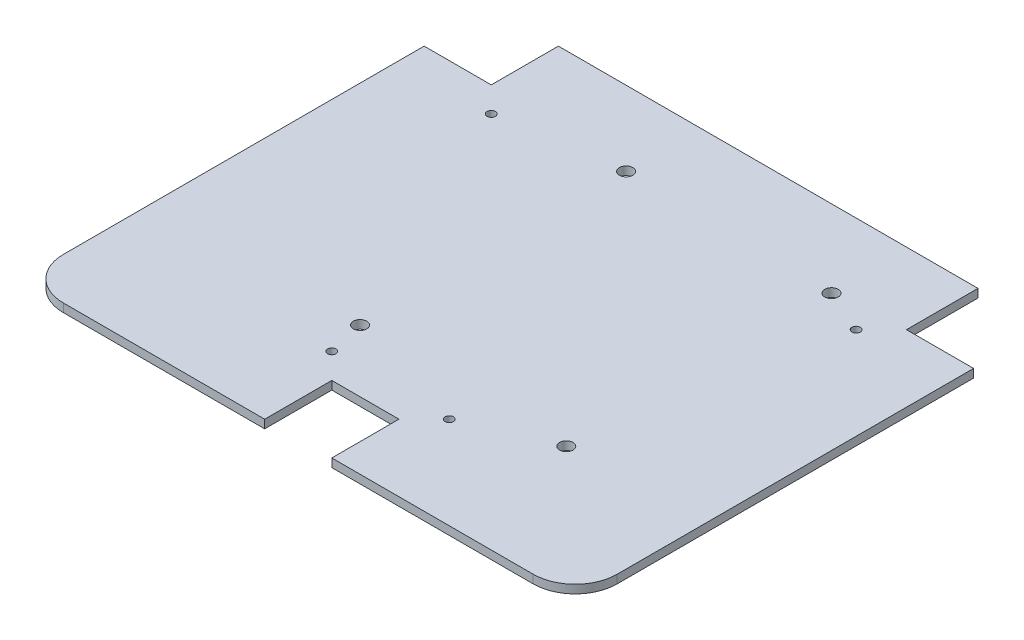
ISO-10303-21;
HEADER;
FILE_DESCRIPTION(('STEP AP214'),'2;1');
FILE_NAME('part.step','',(''),(''),'','','');
FILE_SCHEMA(('AUTOMOTIVE_DESIGN { 1 0 10303 214 1 1 1 1 }'));
ENDSEC;
DATA;
#1=APPLICATION_CONTEXT('core data for automotive mechanical design processes');
#2=APPLICATION_PROTOCOL_DEFINITION('international standard','automotive_design',2000,#1);
#3=PRODUCT_CONTEXT('',#1,'mechanical');
#4=PRODUCT('Part','Part','',(#3));
#5=PRODUCT_RELATED_PRODUCT_CATEGORY('part','',(#4));
#6=PRODUCT_DEFINITION_FORMATION('','',#4);
#7=PRODUCT_DEFINITION_CONTEXT('part definition',#1,'design');
#8=PRODUCT_DEFINITION('design','',#6,#7);
#9=PRODUCT_DEFINITION_SHAPE('','',#8);
#10=(LENGTH_UNIT() NAMED_UNIT(*) SI_UNIT(.MILLI.,.METRE.));
#11=(NAMED_UNIT(*) PLANE_ANGLE_UNIT() SI_UNIT($,.RADIAN.));
#12=(NAMED_UNIT(*) SI_UNIT($,.STERADIAN.) SOLID_ANGLE_UNIT());
#13=UNCERTAINTY_MEASURE_WITH_UNIT(LENGTH_MEASURE(1.E-05),#10,'distance_accuracy_value','');
#14=(GEOMETRIC_REPRESENTATION_CONTEXT(3) GLOBAL_UNCERTAINTY_ASSIGNED_CONTEXT((#13)) GLOBAL_UNIT_ASSIGNED_CONTEXT((#10,
#11,#12)) REPRESENTATION_CONTEXT('',''));
#15=CARTESIAN_POINT('',(0.,0.,0.));
#16=DIRECTION('',(0.,0.,1.));
#17=DIRECTION('',(1.,0.,0.));
#18=AXIS2_PLACEMENT_3D('',#15,#16,#17);
#19=CARTESIAN_POINT('',(0.,5.,155.796995794098));
#20=DIRECTION('',(0.,0.,1.));
#21=DIRECTION('',(1.,0.,0.));
#22=AXIS2_PLACEMENT_3D('',#19,#20,#21);
#23=PLANE('',#22);
#24=DIRECTION('',(-1.,0.,0.));
#25=VECTOR('',#24,1.);
#26=CARTESIAN_POINT('',(0.,0.,155.796995794098));
#27=LINE('',#26,#25);
#28=CARTESIAN_POINT('',(664.267355398383,0.,155.796995794098));
#29=VERTEX_POINT('',#28);
#30=CARTESIAN_POINT('',(544.267355398383,0.,155.796995794098));
#31=VERTEX_POINT('',#30);
#32=EDGE_CURVE('E164',#29,#31,#27,.T.);
#33=ORIENTED_EDGE('',*,*,#32,.F.);
#34=DIRECTION('',(0.,-1.,0.));
#35=VECTOR('',#34,1.);
#36=CARTESIAN_POINT('',(664.267355398383,5.,155.796995794098));
#37=LINE('',#36,#35);
#38=CARTESIAN_POINT('',(664.267355398383,5.,155.796995794098));
#39=VERTEX_POINT('',#38);
#40=EDGE_CURVE('E11',#39,#29,#37,.T.);
#41=ORIENTED_EDGE('',*,*,#40,.F.);
#42=DIRECTION('',(-1.,0.,0.));
#43=VECTOR('',#42,1.);
#44=CARTESIAN_POINT('',(0.,5.,155.796995794098));
#45=LINE('',#44,#43);
#46=CARTESIAN_POINT('',(544.267355398383,5.,155.796995794098));
#47=VERTEX_POINT('',#46);
#48=EDGE_CURVE('E202',#39,#47,#45,.T.);
#49=ORIENTED_EDGE('',*,*,#48,.T.);
#50=DIRECTION('',(0.,-1.,0.));
#51=VECTOR('',#50,1.);
#52=CARTESIAN_POINT('',(544.267355398383,5.,155.796995794098));
#53=LINE('',#52,#51);
#54=EDGE_CURVE('E51',#47,#31,#53,.T.);
#55=ORIENTED_EDGE('',*,*,#54,.T.);
#56=EDGE_LOOP('',(#33,#41,#49,#55));
#57=FACE_BOUND('',#56,.T.);
#58=ADVANCED_FACE('F35',(#57),#23,.T.);
#59=CARTESIAN_POINT('',(664.267355398383,5.,130.796995794098));
#60=DIRECTION('',(0.,-1.,0.));
#61=DIRECTION('',(0.,0.,-1.));
#62=AXIS2_PLACEMENT_3D('',#59,#60,#61);
#63=CYLINDRICAL_SURFACE('',#62,25.);
#64=CARTESIAN_POINT('',(664.267355398383,0.,130.796995794098));
#65=DIRECTION('',(0.,1.,0.));
#66=DIRECTION('',(0.,0.,1.));
#67=AXIS2_PLACEMENT_3D('',#64,#65,#66);
#68=CIRCLE('',#67,25.);
#69=CARTESIAN_POINT('',(689.267355398383,0.,130.796995794098));
#70=VERTEX_POINT('',#69);
#71=EDGE_CURVE('E166',#29,#70,#68,.T.);
#72=ORIENTED_EDGE('',*,*,#71,.T.);
#73=DIRECTION('',(0.,-1.,0.));
#74=VECTOR('',#73,1.);
#75=CARTESIAN_POINT('',(689.267355398383,5.,130.796995794098));
#76=LINE('',#75,#74);
#77=CARTESIAN_POINT('',(689.267355398383,5.,130.796995794098));
#78=VERTEX_POINT('',#77);
#79=EDGE_CURVE('E43',#78,#70,#76,.T.);
#80=ORIENTED_EDGE('',*,*,#79,.F.);
#81=CARTESIAN_POINT('',(664.267355398383,5.,130.796995794098));
#82=DIRECTION('',(0.,1.,0.));
#83=DIRECTION('',(0.,0.,1.));
#84=AXIS2_PLACEMENT_3D('',#81,#82,#83);
#85=CIRCLE('',#84,25.);
#86=EDGE_CURVE('E243',#39,#78,#85,.T.);
#87=ORIENTED_EDGE('',*,*,#86,.F.);
#88=ORIENTED_EDGE('',*,*,#40,.T.);
#89=EDGE_LOOP('',(#72,#80,#87,#88));
#90=FACE_BOUND('',#89,.T.);
#91=ADVANCED_FACE('F231',(#90),#63,.T.);
#92=CARTESIAN_POINT('',(689.267355398383,5.,3.60307849767731E-13));
#93=DIRECTION('',(1.,0.,0.));
#94=DIRECTION('',(0.,0.,-1.));
#95=AXIS2_PLACEMENT_3D('',#92,#93,#94);
#96=PLANE('',#95);
#97=DIRECTION('',(0.,0.,1.));
#98=VECTOR('',#97,1.);
#99=CARTESIAN_POINT('',(689.267355398383,0.,3.60307849767731E-13));
#100=LINE('',#99,#98);
#101=CARTESIAN_POINT('',(689.267355398383,0.,-81.5881877590993));
#102=VERTEX_POINT('',#101);
#103=EDGE_CURVE('E170',#102,#70,#100,.T.);
#104=ORIENTED_EDGE('',*,*,#103,.F.);
#105=DIRECTION('',(0.,-1.,0.));
#106=VECTOR('',#105,1.);
#107=CARTESIAN_POINT('',(689.267355398383,5.,-81.5881877590993));
#108=LINE('',#107,#106);
#109=CARTESIAN_POINT('',(689.267355398383,5.,-81.5881877590993));
#110=VERTEX_POINT('',#109);
#111=EDGE_CURVE('E221',#110,#102,#108,.T.);
#112=ORIENTED_EDGE('',*,*,#111,.F.);
#113=DIRECTION('',(0.,0.,1.));
#114=VECTOR('',#113,1.);
#115=CARTESIAN_POINT('',(689.267355398383,5.,3.60307849767731E-13));
#116=LINE('',#115,#114);
#117=EDGE_CURVE('E228',#110,#78,#116,.T.);
#118=ORIENTED_EDGE('',*,*,#117,.T.);
#119=ORIENTED_EDGE('',*,*,#79,.T.);
#120=EDGE_LOOP('',(#104,#112,#118,#119));
#121=FACE_BOUND('',#120,.T.);
#122=ADVANCED_FACE('F226',(#121),#96,.T.);
#123=CARTESIAN_POINT('',(0.,5.,-81.5881877590993));
#124=DIRECTION('',(0.,0.,-1.));
#125=DIRECTION('',(-1.,0.,0.));
#126=AXIS2_PLACEMENT_3D('',#123,#124,#125);
#127=PLANE('',#126);
#128=DIRECTION('',(1.,0.,0.));
#129=VECTOR('',#128,1.);
#130=CARTESIAN_POINT('',(0.,0.,-81.5881877590993));
#131=LINE('',#130,#129);
#132=CARTESIAN_POINT('',(649.267355398383,0.,-81.5881877590993));
#133=VERTEX_POINT('',#132);
#134=EDGE_CURVE('E173',#133,#102,#131,.T.);
#135=ORIENTED_EDGE('',*,*,#134,.F.);
#136=DIRECTION('',(0.,-1.,0.));
#137=VECTOR('',#136,1.);
#138=CARTESIAN_POINT('',(649.267355398383,5.,-81.5881877590993));
#139=LINE('',#138,#137);
#140=CARTESIAN_POINT('',(649.267355398383,5.,-81.5881877590993));
#141=VERTEX_POINT('',#140);
#142=EDGE_CURVE('E219',#141,#133,#139,.T.);
#143=ORIENTED_EDGE('',*,*,#142,.F.);
#144=DIRECTION('',(1.,0.,0.));
#145=VECTOR('',#144,1.);
#146=CARTESIAN_POINT('',(0.,5.,-81.5881877590993));
#147=LINE('',#146,#145);
#148=EDGE_CURVE('E240',#141,#110,#147,.T.);
#149=ORIENTED_EDGE('',*,*,#148,.T.);
#150=ORIENTED_EDGE('',*,*,#111,.T.);
#151=EDGE_LOOP('',(#135,#143,#149,#150));
#152=FACE_BOUND('',#151,.T.);
#153=ADVANCED_FACE('F237',(#152),#127,.T.);
#154=CARTESIAN_POINT('',(649.267355398383,5.,0.));
#155=DIRECTION('',(1.,0.,0.));
#156=DIRECTION('',(0.,0.,-1.));
#157=AXIS2_PLACEMENT_3D('',#154,#155,#156);
#158=PLANE('',#157);
#159=DIRECTION('',(0.,0.,1.));
#160=VECTOR('',#159,1.);
#161=CARTESIAN_POINT('',(649.267355398383,0.,0.));
#162=LINE('',#161,#160);
#163=CARTESIAN_POINT('',(649.267355398383,0.,-124.203004205901));
#164=VERTEX_POINT('',#163);
#165=EDGE_CURVE('E176',#164,#133,#162,.T.);
#166=ORIENTED_EDGE('',*,*,#165,.F.);
#167=DIRECTION('',(0.,-1.,0.));
#168=VECTOR('',#167,1.);
#169=CARTESIAN_POINT('',(649.267355398383,5.,-124.203004205901));
#170=LINE('',#169,#168);
#171=CARTESIAN_POINT('',(649.267355398383,5.,-124.203004205901));
#172=VERTEX_POINT('',#171);
#173=EDGE_CURVE('E217',#172,#164,#170,.T.);
#174=ORIENTED_EDGE('',*,*,#173,.F.);
#175=DIRECTION('',(0.,0.,1.));
#176=VECTOR('',#175,1.);
#177=CARTESIAN_POINT('',(649.267355398383,5.,0.));
#178=LINE('',#177,#176);
#179=EDGE_CURVE('E245',#172,#141,#178,.T.);
#180=ORIENTED_EDGE('',*,*,#179,.T.);
#181=ORIENTED_EDGE('',*,*,#142,.T.);
#182=EDGE_LOOP('',(#166,#174,#180,#181));
#183=FACE_BOUND('',#182,.T.);
#184=ADVANCED_FACE('F290',(#183),#158,.T.);
#185=CARTESIAN_POINT('',(0.,5.,-124.203004205901));
#186=DIRECTION('',(0.,0.,-1.));
#187=DIRECTION('',(-1.,0.,0.));
#188=AXIS2_PLACEMENT_3D('',#185,#186,#187);
#189=PLANE('',#188);
#190=DIRECTION('',(1.,0.,0.));
#191=VECTOR('',#190,1.);
#192=CARTESIAN_POINT('',(0.,0.,-124.203004205901));
#193=LINE('',#192,#191);
#194=CARTESIAN_POINT('',(399.267355398383,0.,-124.203004205901));
#195=VERTEX_POINT('',#194);
#196=EDGE_CURVE('E179',#195,#164,#193,.T.);
#197=ORIENTED_EDGE('',*,*,#196,.F.);
#198=DIRECTION('',(0.,-1.,0.));
#199=VECTOR('',#198,1.);
#200=CARTESIAN_POINT('',(399.267355398383,5.,-124.203004205901));
#201=LINE('',#200,#199);
#202=CARTESIAN_POINT('',(399.267355398383,5.,-124.203004205901));
#203=VERTEX_POINT('',#202);
#204=EDGE_CURVE('E215',#203,#195,#201,.T.);
#205=ORIENTED_EDGE('',*,*,#204,.F.);
#206=DIRECTION('',(1.,0.,0.));
#207=VECTOR('',#206,1.);
#208=CARTESIAN_POINT('',(0.,5.,-124.203004205901));
#209=LINE('',#208,#207);
#210=EDGE_CURVE('E251',#203,#172,#209,.T.);
#211=ORIENTED_EDGE('',*,*,#210,.T.);
#212=ORIENTED_EDGE('',*,*,#173,.T.);
#213=EDGE_LOOP('',(#197,#205,#211,#212));
#214=FACE_BOUND('',#213,.T.);
#215=ADVANCED_FACE('F293',(#214),#189,.T.);
#216=CARTESIAN_POINT('',(399.267355398383,5.,0.));
#217=DIRECTION('',(1.,0.,0.));
#218=DIRECTION('',(0.,0.,-1.));
#219=AXIS2_PLACEMENT_3D('',#216,#217,#218);
#220=PLANE('',#219);
#221=DIRECTION('',(0.,0.,1.));
#222=VECTOR('',#221,1.);
#223=CARTESIAN_POINT('',(399.267355398383,0.,0.));
#224=LINE('',#223,#222);
#225=CARTESIAN_POINT('',(399.267355398383,0.,-84.2030042059013));
#226=VERTEX_POINT('',#225);
#227=EDGE_CURVE('E182',#195,#226,#224,.T.);
#228=ORIENTED_EDGE('',*,*,#227,.T.);
#229=DIRECTION('',(0.,-1.,0.));
#230=VECTOR('',#229,1.);
#231=CARTESIAN_POINT('',(399.267355398383,5.,-84.2030042059013));
#232=LINE('',#231,#230);
#233=CARTESIAN_POINT('',(399.267355398383,5.,-84.2030042059013));
#234=VERTEX_POINT('',#233);
#235=EDGE_CURVE('E212',#234,#226,#232,.T.);
#236=ORIENTED_EDGE('',*,*,#235,.F.);
#237=DIRECTION('',(0.,0.,1.));
#238=VECTOR('',#237,1.);
#239=CARTESIAN_POINT('',(399.267355398383,5.,0.));
#240=LINE('',#239,#238);
#241=EDGE_CURVE('E254',#203,#234,#240,.T.);
#242=ORIENTED_EDGE('',*,*,#241,.F.);
#243=ORIENTED_EDGE('',*,*,#204,.T.);
#244=EDGE_LOOP('',(#228,#236,#242,#243));
#245=FACE_BOUND('',#244,.T.);
#246=ADVANCED_FACE('F297',(#245),#220,.F.);
#247=CARTESIAN_POINT('',(0.,5.,-84.2030042059013));
#248=DIRECTION('',(0.,0.,1.));
#249=DIRECTION('',(1.,0.,0.));
#250=AXIS2_PLACEMENT_3D('',#247,#248,#249);
#251=PLANE('',#250);
#252=DIRECTION('',(-1.,0.,0.));
#253=VECTOR('',#252,1.);
#254=CARTESIAN_POINT('',(0.,0.,-84.2030042059013));
#255=LINE('',#254,#253);
#256=CARTESIAN_POINT('',(359.267355398383,0.,-84.2030042059013));
#257=VERTEX_POINT('',#256);
#258=EDGE_CURVE('E184',#226,#257,#255,.T.);
#259=ORIENTED_EDGE('',*,*,#258,.T.);
#260=DIRECTION('',(0.,-1.,0.));
#261=VECTOR('',#260,1.);
#262=CARTESIAN_POINT('',(359.267355398383,5.,-84.2030042059013));
#263=LINE('',#262,#261);
#264=CARTESIAN_POINT('',(359.267355398383,5.,-84.2030042059013));
#265=VERTEX_POINT('',#264);
#266=EDGE_CURVE('E210',#265,#257,#263,.T.);
#267=ORIENTED_EDGE('',*,*,#266,.F.);
#268=DIRECTION('',(-1.,0.,0.));
#269=VECTOR('',#268,1.);
#270=CARTESIAN_POINT('',(0.,5.,-84.2030042059013));
#271=LINE('',#270,#269);
#272=EDGE_CURVE('E256',#234,#265,#271,.T.);
#273=ORIENTED_EDGE('',*,*,#272,.F.);
#274=ORIENTED_EDGE('',*,*,#235,.T.);
#275=EDGE_LOOP('',(#259,#267,#273,#274));
#276=FACE_BOUND('',#275,.T.);
#277=ADVANCED_FACE('F301',(#276),#251,.F.);
#278=CARTESIAN_POINT('',(359.267355398383,5.,0.));
#279=DIRECTION('',(-1.,0.,0.));
#280=DIRECTION('',(0.,0.,1.));
#281=AXIS2_PLACEMENT_3D('',#278,#279,#280);
#282=PLANE('',#281);
#283=DIRECTION('',(0.,0.,-1.));
#284=VECTOR('',#283,1.);
#285=CARTESIAN_POINT('',(359.267355398383,0.,0.));
#286=LINE('',#285,#284);
#287=CARTESIAN_POINT('',(359.267355398383,0.,130.796995794098));
#288=VERTEX_POINT('',#287);
#289=EDGE_CURVE('E187',#288,#257,#286,.T.);
#290=ORIENTED_EDGE('',*,*,#289,.F.);
#291=DIRECTION('',(0.,-1.,0.));
#292=VECTOR('',#291,1.);
#293=CARTESIAN_POINT('',(359.267355398383,5.,130.796995794098));
#294=LINE('',#293,#292);
#295=CARTESIAN_POINT('',(359.267355398383,5.,130.796995794098));
#296=VERTEX_POINT('',#295);
#297=EDGE_CURVE('E208',#296,#288,#294,.T.);
#298=ORIENTED_EDGE('',*,*,#297,.F.);
#299=DIRECTION('',(0.,0.,-1.));
#300=VECTOR('',#299,1.);
#301=CARTESIAN_POINT('',(359.267355398383,5.,0.));
#302=LINE('',#301,#300);
#303=EDGE_CURVE('E258',#296,#265,#302,.T.);
#304=ORIENTED_EDGE('',*,*,#303,.T.);
#305=ORIENTED_EDGE('',*,*,#266,.T.);
#306=EDGE_LOOP('',(#290,#298,#304,#305));
#307=FACE_BOUND('',#306,.T.);
#308=ADVANCED_FACE('F305',(#307),#282,.T.);
#309=CARTESIAN_POINT('',(384.267355398383,5.,130.796995794098));
#310=DIRECTION('',(0.,-1.,0.));
#311=DIRECTION('',(0.,0.,-1.));
#312=AXIS2_PLACEMENT_3D('',#309,#310,#311);
#313=CYLINDRICAL_SURFACE('',#312,25.);
#314=CARTESIAN_POINT('',(384.267355398383,0.,130.796995794098));
#315=DIRECTION('',(0.,1.,0.));
#316=DIRECTION('',(0.,0.,1.));
#317=AXIS2_PLACEMENT_3D('',#314,#315,#316);
#318=CIRCLE('',#317,25.);
#319=CARTESIAN_POINT('',(384.267355398383,0.,155.796995794098));
#320=VERTEX_POINT('',#319);
#321=EDGE_CURVE('E190',#288,#320,#318,.T.);
#322=ORIENTED_EDGE('',*,*,#321,.T.);
#323=DIRECTION('',(0.,-1.,0.));
#324=VECTOR('',#323,1.);
#325=CARTESIAN_POINT('',(384.267355398383,5.,155.796995794098));
#326=LINE('',#325,#324);
#327=CARTESIAN_POINT('',(384.267355398383,5.,155.796995794098));
#328=VERTEX_POINT('',#327);
#329=EDGE_CURVE('E206',#328,#320,#326,.T.);
#330=ORIENTED_EDGE('',*,*,#329,.F.);
#331=CARTESIAN_POINT('',(384.267355398383,5.,130.796995794098));
#332=DIRECTION('',(0.,1.,0.));
#333=DIRECTION('',(0.,0.,1.));
#334=AXIS2_PLACEMENT_3D('',#331,#332,#333);
#335=CIRCLE('',#334,25.);
#336=EDGE_CURVE('E261',#296,#328,#335,.T.);
#337=ORIENTED_EDGE('',*,*,#336,.F.);
#338=ORIENTED_EDGE('',*,*,#297,.T.);
#339=EDGE_LOOP('',(#322,#330,#337,#338));
#340=FACE_BOUND('',#339,.T.);
#341=ADVANCED_FACE('F309',(#340),#313,.T.);
#342=CARTESIAN_POINT('',(0.,5.,155.796995794098));
#343=DIRECTION('',(0.,0.,1.));
#344=DIRECTION('',(1.,0.,0.));
#345=AXIS2_PLACEMENT_3D('',#342,#343,#344);
#346=PLANE('',#345);
#347=DIRECTION('',(-1.,0.,0.));
#348=VECTOR('',#347,1.);
#349=CARTESIAN_POINT('',(0.,0.,155.796995794098));
#350=LINE('',#349,#348);
#351=CARTESIAN_POINT('',(504.267355398383,0.,155.796995794098));
#352=VERTEX_POINT('',#351);
#353=EDGE_CURVE('E193',#352,#320,#350,.T.);
#354=ORIENTED_EDGE('',*,*,#353,.F.);
#355=DIRECTION('',(0.,-1.,0.));
#356=VECTOR('',#355,1.);
#357=CARTESIAN_POINT('',(504.267355398383,5.,155.796995794098));
#358=LINE('',#357,#356);
#359=CARTESIAN_POINT('',(504.267355398383,5.,155.796995794098));
#360=VERTEX_POINT('',#359);
#361=EDGE_CURVE('E146',#360,#352,#358,.T.);
#362=ORIENTED_EDGE('',*,*,#361,.F.);
#363=DIRECTION('',(-1.,0.,0.));
#364=VECTOR('',#363,1.);
#365=CARTESIAN_POINT('',(0.,5.,155.796995794098));
#366=LINE('',#365,#364);
#367=EDGE_CURVE('E156',#360,#328,#366,.T.);
#368=ORIENTED_EDGE('',*,*,#367,.T.);
#369=ORIENTED_EDGE('',*,*,#329,.T.);
#370=EDGE_LOOP('',(#354,#362,#368,#369));
#371=FACE_BOUND('',#370,.T.);
#372=ADVANCED_FACE('F264',(#371),#346,.T.);
#373=CARTESIAN_POINT('',(504.267355398383,5.,0.));
#374=DIRECTION('',(1.,0.,0.));
#375=DIRECTION('',(0.,0.,-1.));
#376=AXIS2_PLACEMENT_3D('',#373,#374,#375);
#377=PLANE('',#376);
#378=DIRECTION('',(0.,0.,1.));
#379=VECTOR('',#378,1.);
#380=CARTESIAN_POINT('',(504.267355398383,0.,0.));
#381=LINE('',#380,#379);
#382=CARTESIAN_POINT('',(504.267355398383,0.,115.796995794098));
#383=VERTEX_POINT('',#382);
#384=EDGE_CURVE('E142',#383,#352,#381,.T.);
#385=ORIENTED_EDGE('',*,*,#384,.F.);
#386=DIRECTION('',(0.,-1.,0.));
#387=VECTOR('',#386,1.);
#388=CARTESIAN_POINT('',(504.267355398383,5.,115.796995794098));
#389=LINE('',#388,#387);
#390=CARTESIAN_POINT('',(504.267355398383,5.,115.796995794098));
#391=VERTEX_POINT('',#390);
#392=EDGE_CURVE('E137',#391,#383,#389,.T.);
#393=ORIENTED_EDGE('',*,*,#392,.F.);
#394=DIRECTION('',(0.,0.,1.));
#395=VECTOR('',#394,1.);
#396=CARTESIAN_POINT('',(504.267355398383,5.,0.));
#397=LINE('',#396,#395);
#398=EDGE_CURVE('E140',#391,#360,#397,.T.);
#399=ORIENTED_EDGE('',*,*,#398,.T.);
#400=ORIENTED_EDGE('',*,*,#361,.T.);
#401=EDGE_LOOP('',(#385,#393,#399,#400));
#402=FACE_BOUND('',#401,.T.);
#403=ADVANCED_FACE('F139',(#402),#377,.T.);
#404=CARTESIAN_POINT('',(0.,5.,115.796995794098));
#405=DIRECTION('',(0.,0.,1.));
#406=DIRECTION('',(1.,0.,0.));
#407=AXIS2_PLACEMENT_3D('',#404,#405,#406);
#408=PLANE('',#407);
#409=DIRECTION('',(-1.,0.,0.));
#410=VECTOR('',#409,1.);
#411=CARTESIAN_POINT('',(0.,0.,115.796995794098));
#412=LINE('',#411,#410);
#413=CARTESIAN_POINT('',(544.267355398383,0.,115.796995794098));
#414=VERTEX_POINT('',#413);
#415=EDGE_CURVE('E197',#414,#383,#412,.T.);
#416=ORIENTED_EDGE('',*,*,#415,.F.);
#417=DIRECTION('',(0.,-1.,0.));
#418=VECTOR('',#417,1.);
#419=CARTESIAN_POINT('',(544.267355398383,5.,115.796995794098));
#420=LINE('',#419,#418);
#421=CARTESIAN_POINT('',(544.267355398383,5.,115.796995794098));
#422=VERTEX_POINT('',#421);
#423=EDGE_CURVE('E94',#422,#414,#420,.T.);
#424=ORIENTED_EDGE('',*,*,#423,.F.);
#425=DIRECTION('',(-1.,0.,0.));
#426=VECTOR('',#425,1.);
#427=CARTESIAN_POINT('',(0.,5.,115.796995794098));
#428=LINE('',#427,#426);
#429=EDGE_CURVE('E154',#422,#391,#428,.T.);
#430=ORIENTED_EDGE('',*,*,#429,.T.);
#431=ORIENTED_EDGE('',*,*,#392,.T.);
#432=EDGE_LOOP('',(#416,#424,#430,#431));
#433=FACE_BOUND('',#432,.T.);
#434=ADVANCED_FACE('F158',(#433),#408,.T.);
#435=CARTESIAN_POINT('',(544.267355398383,5.,0.));
#436=DIRECTION('',(-1.,0.,0.));
#437=DIRECTION('',(0.,0.,1.));
#438=AXIS2_PLACEMENT_3D('',#435,#436,#437);
#439=PLANE('',#438);
#440=DIRECTION('',(0.,0.,-1.));
#441=VECTOR('',#440,1.);
#442=CARTESIAN_POINT('',(544.267355398383,0.,0.));
#443=LINE('',#442,#441);
#444=EDGE_CURVE('E199',#31,#414,#443,.T.);
#445=ORIENTED_EDGE('',*,*,#444,.F.);
#446=ORIENTED_EDGE('',*,*,#54,.F.);
#447=DIRECTION('',(0.,0.,-1.));
#448=VECTOR('',#447,1.);
#449=CARTESIAN_POINT('',(544.267355398383,5.,0.));
#450=LINE('',#449,#448);
#451=EDGE_CURVE('E159',#47,#422,#450,.T.);
#452=ORIENTED_EDGE('',*,*,#451,.T.);
#453=ORIENTED_EDGE('',*,*,#423,.T.);
#454=EDGE_LOOP('',(#445,#446,#452,#453));
#455=FACE_BOUND('',#454,.T.);
#456=ADVANCED_FACE('F267',(#455),#439,.T.);
#457=CARTESIAN_POINT('',(0.,5.,0.));
#458=DIRECTION('',(0.,1.,0.));
#459=DIRECTION('',(0.,0.,1.));
#460=AXIS2_PLACEMENT_3D('',#457,#458,#459);
#461=PLANE('',#460);
#462=CARTESIAN_POINT('',(608.081782449135,5.,79.9132219780713));
#463=DIRECTION('',(0.,1.,0.));
#464=DIRECTION('',(0.,0.,1.));
#465=AXIS2_PLACEMENT_3D('',#462,#463,#464);
#466=CIRCLE('',#465,3.99999999999999);
#467=CARTESIAN_POINT('',(608.081782449135,5.,83.9132219780713));
#468=VERTEX_POINT('',#467);
#469=EDGE_CURVE('E428',#468,#468,#466,.T.);
#470=ORIENTED_EDGE('',*,*,#469,.F.);
#471=EDGE_LOOP('',(#470));
#472=FACE_BOUND('',#471,.T.);
#473=CARTESIAN_POINT('',(484.081782449135,5.,-79.7118501264468));
#474=DIRECTION('',(0.,1.,0.));
#475=DIRECTION('',(0.,0.,1.));
#476=AXIS2_PLACEMENT_3D('',#473,#474,#475);
#477=CIRCLE('',#476,3.99999999999999);
#478=CARTESIAN_POINT('',(484.081782449135,5.,-75.7118501264468));
#479=VERTEX_POINT('',#478);
#480=EDGE_CURVE('E434',#479,#479,#477,.T.);
#481=ORIENTED_EDGE('',*,*,#480,.F.);
#482=EDGE_LOOP('',(#481));
#483=FACE_BOUND('',#482,.T.);
#484=CARTESIAN_POINT('',(608.081782449135,5.,-78.0867780219286));
#485=DIRECTION('',(0.,1.,0.));
#486=DIRECTION('',(0.,0.,1.));
#487=AXIS2_PLACEMENT_3D('',#484,#485,#486);
#488=CIRCLE('',#487,3.99999999999999);
#489=CARTESIAN_POINT('',(608.081782449135,5.,-74.0867780219286));
#490=VERTEX_POINT('',#489);
#491=EDGE_CURVE('E496',#490,#490,#488,.T.);
#492=ORIENTED_EDGE('',*,*,#491,.F.);
#493=EDGE_LOOP('',(#492));
#494=FACE_BOUND('',#493,.T.);
#495=CARTESIAN_POINT('',(484.081782449135,5.,78.7969957940983));
#496=DIRECTION('',(0.,1.,0.));
#497=DIRECTION('',(0.,0.,1.));
#498=AXIS2_PLACEMENT_3D('',#495,#496,#497);
#499=CIRCLE('',#498,3.99999999999999);
#500=CARTESIAN_POINT('',(484.081782449135,5.,82.7969957940983));
#501=VERTEX_POINT('',#500);
#502=EDGE_CURVE('E431',#501,#501,#499,.T.);
#503=ORIENTED_EDGE('',*,*,#502,.F.);
#504=EDGE_LOOP('',(#503));
#505=FACE_BOUND('',#504,.T.);
#506=CARTESIAN_POINT('',(414.267355398383,5.,-69.2030042059013));
#507=DIRECTION('',(0.,1.,0.));
#508=DIRECTION('',(0.,0.,1.));
#509=AXIS2_PLACEMENT_3D('',#506,#507,#508);
#510=CIRCLE('',#509,2.50000000000002);
#511=CARTESIAN_POINT('',(414.267355398383,5.,-66.7030042059013));
#512=VERTEX_POINT('',#511);
#513=EDGE_CURVE('E444',#512,#512,#510,.T.);
#514=ORIENTED_EDGE('',*,*,#513,.F.);
#515=EDGE_LOOP('',(#514));
#516=FACE_BOUND('',#515,.T.);
#517=CARTESIAN_POINT('',(634.267355398383,5.,-66.5881877590992));
#518=DIRECTION('',(0.,1.,0.));
#519=DIRECTION('',(0.,0.,1.));
#520=AXIS2_PLACEMENT_3D('',#517,#518,#519);
#521=CIRCLE('',#520,2.50000000000003);
#522=CARTESIAN_POINT('',(634.267355398383,5.,-64.0881877590992));
#523=VERTEX_POINT('',#522);
#524=EDGE_CURVE('E457',#523,#523,#521,.T.);
#525=ORIENTED_EDGE('',*,*,#524,.F.);
#526=EDGE_LOOP('',(#525));
#527=FACE_BOUND('',#526,.T.);
#528=CARTESIAN_POINT('',(489.267355398383,5.,100.796995794098));
#529=DIRECTION('',(0.,1.,0.));
#530=DIRECTION('',(0.,0.,1.));
#531=AXIS2_PLACEMENT_3D('',#528,#529,#530);
#532=CIRCLE('',#531,2.50000000000002);
#533=CARTESIAN_POINT('',(489.267355398383,5.,103.296995794098));
#534=VERTEX_POINT('',#533);
#535=EDGE_CURVE('E451',#534,#534,#532,.T.);
#536=ORIENTED_EDGE('',*,*,#535,.F.);
#537=EDGE_LOOP('',(#536));
#538=FACE_BOUND('',#537,.T.);
#539=CARTESIAN_POINT('',(559.267355398383,5.,100.796995794098));
#540=DIRECTION('',(0.,1.,0.));
#541=DIRECTION('',(0.,0.,1.));
#542=AXIS2_PLACEMENT_3D('',#539,#540,#541);
#543=CIRCLE('',#542,2.50000000000003);
#544=CARTESIAN_POINT('',(559.267355398383,5.,103.296995794098));
#545=VERTEX_POINT('',#544);
#546=EDGE_CURVE('E450',#545,#545,#543,.T.);
#547=ORIENTED_EDGE('',*,*,#546,.F.);
#548=EDGE_LOOP('',(#547));
#549=FACE_BOUND('',#548,.T.);
#550=ORIENTED_EDGE('',*,*,#48,.F.);
#551=ORIENTED_EDGE('',*,*,#86,.T.);
#552=ORIENTED_EDGE('',*,*,#117,.F.);
#553=ORIENTED_EDGE('',*,*,#148,.F.);
#554=ORIENTED_EDGE('',*,*,#179,.F.);
#555=ORIENTED_EDGE('',*,*,#210,.F.);
#556=ORIENTED_EDGE('',*,*,#241,.T.);
#557=ORIENTED_EDGE('',*,*,#272,.T.);
#558=ORIENTED_EDGE('',*,*,#303,.F.);
#559=ORIENTED_EDGE('',*,*,#336,.T.);
#560=ORIENTED_EDGE('',*,*,#367,.F.);
#561=ORIENTED_EDGE('',*,*,#398,.F.);
#562=ORIENTED_EDGE('',*,*,#429,.F.);
#563=ORIENTED_EDGE('',*,*,#451,.F.);
#564=EDGE_LOOP('',(#550,#551,#552,#553,#554,#555,#556,#557,#558,#559,#560,#561,#562,#563));
#565=FACE_BOUND('',#564,.T.);
#566=ADVANCED_FACE('F152',(#472,#483,#494,#505,#516,#527,#538,#549,#565),#461,.T.);
#567=CARTESIAN_POINT('',(0.,0.,0.));
#568=DIRECTION('',(0.,1.,0.));
#569=DIRECTION('',(0.,0.,1.));
#570=AXIS2_PLACEMENT_3D('',#567,#568,#569);
#571=PLANE('',#570);
#572=CARTESIAN_POINT('',(608.081782449135,0.,79.9132219780713));
#573=DIRECTION('',(0.,1.,0.));
#574=DIRECTION('',(0.,0.,1.));
#575=AXIS2_PLACEMENT_3D('',#572,#573,#574);
#576=CIRCLE('',#575,3.99999999999999);
#577=CARTESIAN_POINT('',(608.081782449135,0.,83.9132219780713));
#578=VERTEX_POINT('',#577);
#579=EDGE_CURVE('E425',#578,#578,#576,.T.);
#580=ORIENTED_EDGE('',*,*,#579,.T.);
#581=EDGE_LOOP('',(#580));
#582=FACE_BOUND('',#581,.T.);
#583=CARTESIAN_POINT('',(484.081782449135,0.,-79.7118501264468));
#584=DIRECTION('',(0.,1.,0.));
#585=DIRECTION('',(0.,0.,1.));
#586=AXIS2_PLACEMENT_3D('',#583,#584,#585);
#587=CIRCLE('',#586,3.99999999999999);
#588=CARTESIAN_POINT('',(484.081782449135,0.,-75.7118501264468));
#589=VERTEX_POINT('',#588);
#590=EDGE_CURVE('E429',#589,#589,#587,.T.);
#591=ORIENTED_EDGE('',*,*,#590,.T.);
#592=EDGE_LOOP('',(#591));
#593=FACE_BOUND('',#592,.T.);
#594=CARTESIAN_POINT('',(608.081782449135,0.,-78.0867780219286));
#595=DIRECTION('',(0.,1.,0.));
#596=DIRECTION('',(0.,0.,1.));
#597=AXIS2_PLACEMENT_3D('',#594,#595,#596);
#598=CIRCLE('',#597,3.99999999999999);
#599=CARTESIAN_POINT('',(608.081782449135,0.,-74.0867780219286));
#600=VERTEX_POINT('',#599);
#601=EDGE_CURVE('E440',#600,#600,#598,.T.);
#602=ORIENTED_EDGE('',*,*,#601,.T.);
#603=EDGE_LOOP('',(#602));
#604=FACE_BOUND('',#603,.T.);
#605=CARTESIAN_POINT('',(484.081782449135,0.,78.7969957940983));
#606=DIRECTION('',(0.,1.,0.));
#607=DIRECTION('',(0.,0.,1.));
#608=AXIS2_PLACEMENT_3D('',#605,#606,#607);
#609=CIRCLE('',#608,3.99999999999999);
#610=CARTESIAN_POINT('',(484.081782449135,0.,82.7969957940983));
#611=VERTEX_POINT('',#610);
#612=EDGE_CURVE('E441',#611,#611,#609,.T.);
#613=ORIENTED_EDGE('',*,*,#612,.T.);
#614=EDGE_LOOP('',(#613));
#615=FACE_BOUND('',#614,.T.);
#616=CARTESIAN_POINT('',(414.267355398383,0.,-69.2030042059013));
#617=DIRECTION('',(0.,1.,0.));
#618=DIRECTION('',(0.,0.,1.));
#619=AXIS2_PLACEMENT_3D('',#616,#617,#618);
#620=CIRCLE('',#619,2.50000000000002);
#621=CARTESIAN_POINT('',(414.267355398383,0.,-66.7030042059013));
#622=VERTEX_POINT('',#621);
#623=EDGE_CURVE('E460',#622,#622,#620,.T.);
#624=ORIENTED_EDGE('',*,*,#623,.T.);
#625=EDGE_LOOP('',(#624));
#626=FACE_BOUND('',#625,.T.);
#627=CARTESIAN_POINT('',(634.267355398383,0.,-66.5881877590992));
#628=DIRECTION('',(0.,1.,0.));
#629=DIRECTION('',(0.,0.,1.));
#630=AXIS2_PLACEMENT_3D('',#627,#628,#629);
#631=CIRCLE('',#630,2.50000000000003);
#632=CARTESIAN_POINT('',(634.267355398383,0.,-64.0881877590992));
#633=VERTEX_POINT('',#632);
#634=EDGE_CURVE('E454',#633,#633,#631,.T.);
#635=ORIENTED_EDGE('',*,*,#634,.T.);
#636=EDGE_LOOP('',(#635));
#637=FACE_BOUND('',#636,.T.);
#638=CARTESIAN_POINT('',(489.267355398383,0.,100.796995794098));
#639=DIRECTION('',(0.,1.,0.));
#640=DIRECTION('',(0.,0.,1.));
#641=AXIS2_PLACEMENT_3D('',#638,#639,#640);
#642=CIRCLE('',#641,2.50000000000002);
#643=CARTESIAN_POINT('',(489.267355398383,0.,103.296995794098));
#644=VERTEX_POINT('',#643);
#645=EDGE_CURVE('E447',#644,#644,#642,.T.);
#646=ORIENTED_EDGE('',*,*,#645,.T.);
#647=EDGE_LOOP('',(#646));
#648=FACE_BOUND('',#647,.T.);
#649=CARTESIAN_POINT('',(559.267355398383,0.,100.796995794098));
#650=DIRECTION('',(0.,1.,0.));
#651=DIRECTION('',(0.,0.,1.));
#652=AXIS2_PLACEMENT_3D('',#649,#650,#651);
#653=CIRCLE('',#652,2.50000000000003);
#654=CARTESIAN_POINT('',(559.267355398383,0.,103.296995794098));
#655=VERTEX_POINT('',#654);
#656=EDGE_CURVE('E167',#655,#655,#653,.T.);
#657=ORIENTED_EDGE('',*,*,#656,.T.);
#658=EDGE_LOOP('',(#657));
#659=FACE_BOUND('',#658,.T.);
#660=ORIENTED_EDGE('',*,*,#32,.T.);
#661=ORIENTED_EDGE('',*,*,#444,.T.);
#662=ORIENTED_EDGE('',*,*,#415,.T.);
#663=ORIENTED_EDGE('',*,*,#384,.T.);
#664=ORIENTED_EDGE('',*,*,#353,.T.);
#665=ORIENTED_EDGE('',*,*,#321,.F.);
#666=ORIENTED_EDGE('',*,*,#289,.T.);
#667=ORIENTED_EDGE('',*,*,#258,.F.);
#668=ORIENTED_EDGE('',*,*,#227,.F.);
#669=ORIENTED_EDGE('',*,*,#196,.T.);
#670=ORIENTED_EDGE('',*,*,#165,.T.);
#671=ORIENTED_EDGE('',*,*,#134,.T.);
#672=ORIENTED_EDGE('',*,*,#103,.T.);
#673=ORIENTED_EDGE('',*,*,#71,.F.);
#674=EDGE_LOOP('',(#660,#661,#662,#663,#664,#665,#666,#667,#668,#669,#670,#671,#672,#673));
#675=FACE_BOUND('',#674,.T.);
#676=ADVANCED_FACE('F233',(#582,#593,#604,#615,#626,#637,#648,#659,#675),#571,.F.);
#677=CARTESIAN_POINT('',(559.267355398383,0.,100.796995794098));
#678=DIRECTION('',(0.,1.,0.));
#679=DIRECTION('',(0.,0.,1.));
#680=AXIS2_PLACEMENT_3D('',#677,#678,#679);
#681=CYLINDRICAL_SURFACE('',#680,2.50000000000003);
#682=ORIENTED_EDGE('',*,*,#656,.F.);
#683=EDGE_LOOP('',(#682));
#684=FACE_BOUND('',#683,.T.);
#685=ORIENTED_EDGE('',*,*,#546,.T.);
#686=EDGE_LOOP('',(#685));
#687=FACE_BOUND('',#686,.T.);
#688=ADVANCED_FACE('F335',(#684,#687),#681,.F.);
#689=CARTESIAN_POINT('',(489.267355398383,0.,100.796995794098));
#690=DIRECTION('',(0.,1.,0.));
#691=DIRECTION('',(0.,0.,1.));
#692=AXIS2_PLACEMENT_3D('',#689,#690,#691);
#693=CYLINDRICAL_SURFACE('',#692,2.50000000000002);
#694=ORIENTED_EDGE('',*,*,#645,.F.);
#695=EDGE_LOOP('',(#694));
#696=FACE_BOUND('',#695,.T.);
#697=ORIENTED_EDGE('',*,*,#535,.T.);
#698=EDGE_LOOP('',(#697));
#699=FACE_BOUND('',#698,.T.);
#700=ADVANCED_FACE('F340',(#696,#699),#693,.F.);
#701=CARTESIAN_POINT('',(634.267355398383,0.,-66.5881877590992));
#702=DIRECTION('',(0.,1.,0.));
#703=DIRECTION('',(0.,0.,1.));
#704=AXIS2_PLACEMENT_3D('',#701,#702,#703);
#705=CYLINDRICAL_SURFACE('',#704,2.50000000000003);
#706=ORIENTED_EDGE('',*,*,#634,.F.);
#707=EDGE_LOOP('',(#706));
#708=FACE_BOUND('',#707,.T.);
#709=ORIENTED_EDGE('',*,*,#524,.T.);
#710=EDGE_LOOP('',(#709));
#711=FACE_BOUND('',#710,.T.);
#712=ADVANCED_FACE('F352',(#708,#711),#705,.F.);
#713=CARTESIAN_POINT('',(414.267355398383,0.,-69.2030042059013));
#714=DIRECTION('',(0.,1.,0.));
#715=DIRECTION('',(0.,0.,1.));
#716=AXIS2_PLACEMENT_3D('',#713,#714,#715);
#717=CYLINDRICAL_SURFACE('',#716,2.50000000000002);
#718=ORIENTED_EDGE('',*,*,#623,.F.);
#719=EDGE_LOOP('',(#718));
#720=FACE_BOUND('',#719,.T.);
#721=ORIENTED_EDGE('',*,*,#513,.T.);
#722=EDGE_LOOP('',(#721));
#723=FACE_BOUND('',#722,.T.);
#724=ADVANCED_FACE('F362',(#720,#723),#717,.F.);
#725=CARTESIAN_POINT('',(484.081782449135,0.,78.7969957940983));
#726=DIRECTION('',(0.,1.,0.));
#727=DIRECTION('',(0.,0.,1.));
#728=AXIS2_PLACEMENT_3D('',#725,#726,#727);
#729=CYLINDRICAL_SURFACE('',#728,3.99999999999999);
#730=ORIENTED_EDGE('',*,*,#612,.F.);
#731=EDGE_LOOP('',(#730));
#732=FACE_BOUND('',#731,.T.);
#733=ORIENTED_EDGE('',*,*,#502,.T.);
#734=EDGE_LOOP('',(#733));
#735=FACE_BOUND('',#734,.T.);
#736=ADVANCED_FACE('F371',(#732,#735),#729,.F.);
#737=CARTESIAN_POINT('',(608.081782449135,0.,-78.0867780219286));
#738=DIRECTION('',(0.,1.,0.));
#739=DIRECTION('',(0.,0.,1.));
#740=AXIS2_PLACEMENT_3D('',#737,#738,#739);
#741=CYLINDRICAL_SURFACE('',#740,3.99999999999999);
#742=ORIENTED_EDGE('',*,*,#601,.F.);
#743=EDGE_LOOP('',(#742));
#744=FACE_BOUND('',#743,.T.);
#745=ORIENTED_EDGE('',*,*,#491,.T.);
#746=EDGE_LOOP('',(#745));
#747=FACE_BOUND('',#746,.T.);
#748=ADVANCED_FACE('F388',(#744,#747),#741,.F.);
#749=CARTESIAN_POINT('',(484.081782449135,0.,-79.7118501264468));
#750=DIRECTION('',(0.,1.,0.));
#751=DIRECTION('',(0.,0.,1.));
#752=AXIS2_PLACEMENT_3D('',#749,#750,#751);
#753=CYLINDRICAL_SURFACE('',#752,3.99999999999999);
#754=ORIENTED_EDGE('',*,*,#590,.F.);
#755=EDGE_LOOP('',(#754));
#756=FACE_BOUND('',#755,.T.);
#757=ORIENTED_EDGE('',*,*,#480,.T.);
#758=EDGE_LOOP('',(#757));
#759=FACE_BOUND('',#758,.T.);
#760=ADVANCED_FACE('F398',(#756,#759),#753,.F.);
#761=CARTESIAN_POINT('',(608.081782449135,0.,79.9132219780713));
#762=DIRECTION('',(0.,1.,0.));
#763=DIRECTION('',(0.,0.,1.));
#764=AXIS2_PLACEMENT_3D('',#761,#762,#763);
#765=CYLINDRICAL_SURFACE('',#764,3.99999999999999);
#766=ORIENTED_EDGE('',*,*,#579,.F.);
#767=EDGE_LOOP('',(#766));
#768=FACE_BOUND('',#767,.T.);
#769=ORIENTED_EDGE('',*,*,#469,.T.);
#770=EDGE_LOOP('',(#769));
#771=FACE_BOUND('',#770,.T.);
#772=ADVANCED_FACE('F408',(#768,#771),#765,.F.);
#773=CLOSED_SHELL('',(#58,#91,#122,#153,#184,#215,#246,#277,#308,#341,#372,#403,#434,#456,#566,
#676,#688,#700,#712,#724,#736,#748,#760,#772));
#774=MANIFOLD_SOLID_BREP('B2',#773);
#775=ADVANCED_BREP_SHAPE_REPRESENTATION('',(#18,#774),#14);
#776=SHAPE_DEFINITION_REPRESENTATION(#9,#775);
ENDSEC;
END-ISO-10303-21;
